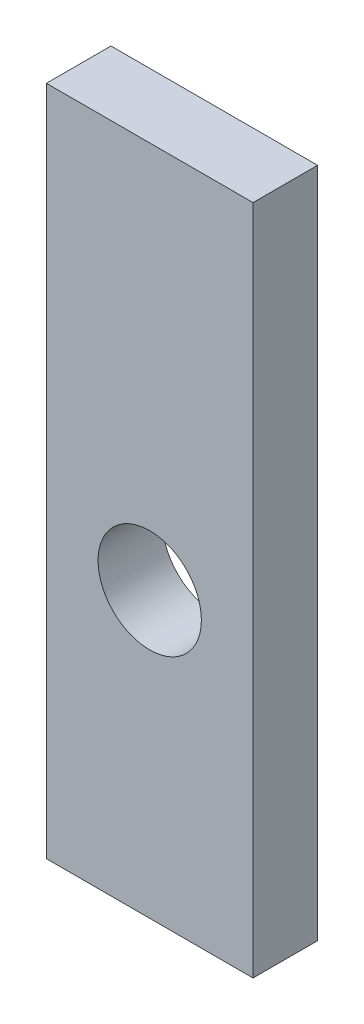
ISO-10303-21;
HEADER;
FILE_DESCRIPTION(('STEP AP214'),'2;1');
FILE_NAME('part.step','',(''),(''),'','','');
FILE_SCHEMA(('AUTOMOTIVE_DESIGN { 1 0 10303 214 1 1 1 1 }'));
ENDSEC;
DATA;
#1=APPLICATION_CONTEXT('core data for automotive mechanical design processes');
#2=APPLICATION_PROTOCOL_DEFINITION('international standard','automotive_design',2000,#1);
#3=PRODUCT_CONTEXT('',#1,'mechanical');
#4=PRODUCT('Part','Part','',(#3));
#5=PRODUCT_RELATED_PRODUCT_CATEGORY('part','',(#4));
#6=PRODUCT_DEFINITION_FORMATION('','',#4);
#7=PRODUCT_DEFINITION_CONTEXT('part definition',#1,'design');
#8=PRODUCT_DEFINITION('design','',#6,#7);
#9=PRODUCT_DEFINITION_SHAPE('','',#8);
#10=(LENGTH_UNIT() NAMED_UNIT(*) SI_UNIT(.MILLI.,.METRE.));
#11=(NAMED_UNIT(*) PLANE_ANGLE_UNIT() SI_UNIT($,.RADIAN.));
#12=(NAMED_UNIT(*) SI_UNIT($,.STERADIAN.) SOLID_ANGLE_UNIT());
#13=UNCERTAINTY_MEASURE_WITH_UNIT(LENGTH_MEASURE(1.E-05),#10,'distance_accuracy_value','');
#14=(GEOMETRIC_REPRESENTATION_CONTEXT(3) GLOBAL_UNCERTAINTY_ASSIGNED_CONTEXT((#13)) GLOBAL_UNIT_ASSIGNED_CONTEXT((#10,
#11,#12)) REPRESENTATION_CONTEXT('',''));
#15=CARTESIAN_POINT('',(0.,0.,0.));
#16=DIRECTION('',(0.,0.,1.));
#17=DIRECTION('',(1.,0.,0.));
#18=AXIS2_PLACEMENT_3D('',#15,#16,#17);
#19=CARTESIAN_POINT('',(8.,30.,2.5));
#20=DIRECTION('',(0.,0.,-1.));
#21=DIRECTION('',(-1.,0.,0.));
#22=AXIS2_PLACEMENT_3D('',#19,#20,#21);
#23=PLANE('',#22);
#24=DIRECTION('',(0.,1.,0.));
#25=VECTOR('',#24,1.);
#26=CARTESIAN_POINT('',(8.,-22.,2.5));
#27=LINE('',#26,#25);
#28=CARTESIAN_POINT('',(8.,-22.,2.5));
#29=VERTEX_POINT('',#28);
#30=CARTESIAN_POINT('',(8.,30.,2.5));
#31=VERTEX_POINT('',#30);
#32=EDGE_CURVE('E84',#29,#31,#27,.T.);
#33=ORIENTED_EDGE('',*,*,#32,.T.);
#34=DIRECTION('',(-1.,0.,0.));
#35=VECTOR('',#34,1.);
#36=CARTESIAN_POINT('',(-8.,30.,2.5));
#37=LINE('',#36,#35);
#38=CARTESIAN_POINT('',(-8.,30.,2.5));
#39=VERTEX_POINT('',#38);
#40=EDGE_CURVE('E79',#31,#39,#37,.T.);
#41=ORIENTED_EDGE('',*,*,#40,.T.);
#42=DIRECTION('',(0.,-1.,0.));
#43=VECTOR('',#42,1.);
#44=CARTESIAN_POINT('',(-8.,-22.,2.5));
#45=LINE('',#44,#43);
#46=CARTESIAN_POINT('',(-8.,-22.,2.5));
#47=VERTEX_POINT('',#46);
#48=EDGE_CURVE('E82',#39,#47,#45,.T.);
#49=ORIENTED_EDGE('',*,*,#48,.T.);
#50=DIRECTION('',(1.,0.,0.));
#51=VECTOR('',#50,1.);
#52=CARTESIAN_POINT('',(-8.,-22.,2.5));
#53=LINE('',#52,#51);
#54=EDGE_CURVE('E49',#47,#29,#53,.T.);
#55=ORIENTED_EDGE('',*,*,#54,.T.);
#56=EDGE_LOOP('',(#33,#41,#49,#55));
#57=FACE_BOUND('',#56,.T.);
#58=CARTESIAN_POINT('',(0.,0.,2.5));
#59=DIRECTION('',(0.,0.,1.));
#60=DIRECTION('',(1.,0.,0.));
#61=AXIS2_PLACEMENT_3D('',#58,#59,#60);
#62=CIRCLE('',#61,4.);
#63=CARTESIAN_POINT('',(4.,0.,2.5));
#64=VERTEX_POINT('',#63);
#65=EDGE_CURVE('E99',#64,#64,#62,.T.);
#66=ORIENTED_EDGE('',*,*,#65,.F.);
#67=EDGE_LOOP('',(#66));
#68=FACE_BOUND('',#67,.T.);
#69=ADVANCED_FACE('F32',(#57,#68),#23,.F.);
#70=CARTESIAN_POINT('',(8.,30.,-2.5));
#71=DIRECTION('',(0.,0.,-1.));
#72=DIRECTION('',(-1.,0.,0.));
#73=AXIS2_PLACEMENT_3D('',#70,#71,#72);
#74=PLANE('',#73);
#75=DIRECTION('',(0.,1.,0.));
#76=VECTOR('',#75,1.);
#77=CARTESIAN_POINT('',(8.,-22.,-2.5));
#78=LINE('',#77,#76);
#79=CARTESIAN_POINT('',(8.,-22.,-2.5));
#80=VERTEX_POINT('',#79);
#81=CARTESIAN_POINT('',(8.,30.,-2.5));
#82=VERTEX_POINT('',#81);
#83=EDGE_CURVE('E96',#80,#82,#78,.T.);
#84=ORIENTED_EDGE('',*,*,#83,.F.);
#85=DIRECTION('',(1.,0.,0.));
#86=VECTOR('',#85,1.);
#87=CARTESIAN_POINT('',(-8.,-22.,-2.5));
#88=LINE('',#87,#86);
#89=CARTESIAN_POINT('',(-8.,-22.,-2.5));
#90=VERTEX_POINT('',#89);
#91=EDGE_CURVE('E72',#90,#80,#88,.T.);
#92=ORIENTED_EDGE('',*,*,#91,.F.);
#93=DIRECTION('',(0.,-1.,0.));
#94=VECTOR('',#93,1.);
#95=CARTESIAN_POINT('',(-8.,-22.,-2.5));
#96=LINE('',#95,#94);
#97=CARTESIAN_POINT('',(-8.,30.,-2.5));
#98=VERTEX_POINT('',#97);
#99=EDGE_CURVE('E66',#98,#90,#96,.T.);
#100=ORIENTED_EDGE('',*,*,#99,.F.);
#101=DIRECTION('',(-1.,0.,0.));
#102=VECTOR('',#101,1.);
#103=CARTESIAN_POINT('',(-8.,30.,-2.5));
#104=LINE('',#103,#102);
#105=EDGE_CURVE('E88',#82,#98,#104,.T.);
#106=ORIENTED_EDGE('',*,*,#105,.F.);
#107=EDGE_LOOP('',(#84,#92,#100,#106));
#108=FACE_BOUND('',#107,.T.);
#109=CARTESIAN_POINT('',(0.,0.,-2.5));
#110=DIRECTION('',(0.,0.,1.));
#111=DIRECTION('',(1.,0.,0.));
#112=AXIS2_PLACEMENT_3D('',#109,#110,#111);
#113=CIRCLE('',#112,4.);
#114=CARTESIAN_POINT('',(4.,0.,-2.5));
#115=VERTEX_POINT('',#114);
#116=EDGE_CURVE('E111',#115,#115,#113,.T.);
#117=ORIENTED_EDGE('',*,*,#116,.T.);
#118=EDGE_LOOP('',(#117));
#119=FACE_BOUND('',#118,.T.);
#120=ADVANCED_FACE('F107',(#108,#119),#74,.T.);
#121=CARTESIAN_POINT('',(8.,-22.,2.5));
#122=DIRECTION('',(-1.,0.,0.));
#123=DIRECTION('',(0.,0.,1.));
#124=AXIS2_PLACEMENT_3D('',#121,#122,#123);
#125=PLANE('',#124);
#126=ORIENTED_EDGE('',*,*,#83,.T.);
#127=DIRECTION('',(0.,0.,-1.));
#128=VECTOR('',#127,1.);
#129=CARTESIAN_POINT('',(8.,30.,2.5));
#130=LINE('',#129,#128);
#131=EDGE_CURVE('E11',#31,#82,#130,.T.);
#132=ORIENTED_EDGE('',*,*,#131,.F.);
#133=ORIENTED_EDGE('',*,*,#32,.F.);
#134=DIRECTION('',(0.,0.,-1.));
#135=VECTOR('',#134,1.);
#136=CARTESIAN_POINT('',(8.,-22.,2.5));
#137=LINE('',#136,#135);
#138=EDGE_CURVE('E92',#29,#80,#137,.T.);
#139=ORIENTED_EDGE('',*,*,#138,.T.);
#140=EDGE_LOOP('',(#126,#132,#133,#139));
#141=FACE_BOUND('',#140,.T.);
#142=ADVANCED_FACE('F34',(#141),#125,.F.);
#143=CARTESIAN_POINT('',(-8.,30.,2.5));
#144=DIRECTION('',(0.,-1.,0.));
#145=DIRECTION('',(0.,0.,-1.));
#146=AXIS2_PLACEMENT_3D('',#143,#144,#145);
#147=PLANE('',#146);
#148=ORIENTED_EDGE('',*,*,#105,.T.);
#149=DIRECTION('',(0.,0.,-1.));
#150=VECTOR('',#149,1.);
#151=CARTESIAN_POINT('',(-8.,30.,2.5));
#152=LINE('',#151,#150);
#153=EDGE_CURVE('E41',#39,#98,#152,.T.);
#154=ORIENTED_EDGE('',*,*,#153,.F.);
#155=ORIENTED_EDGE('',*,*,#40,.F.);
#156=ORIENTED_EDGE('',*,*,#131,.T.);
#157=EDGE_LOOP('',(#148,#154,#155,#156));
#158=FACE_BOUND('',#157,.T.);
#159=ADVANCED_FACE('F87',(#158),#147,.F.);
#160=CARTESIAN_POINT('',(-8.,-22.,2.5));
#161=DIRECTION('',(1.,0.,0.));
#162=DIRECTION('',(0.,0.,-1.));
#163=AXIS2_PLACEMENT_3D('',#160,#161,#162);
#164=PLANE('',#163);
#165=ORIENTED_EDGE('',*,*,#99,.T.);
#166=DIRECTION('',(0.,0.,-1.));
#167=VECTOR('',#166,1.);
#168=CARTESIAN_POINT('',(-8.,-22.,2.5));
#169=LINE('',#168,#167);
#170=EDGE_CURVE('E89',#47,#90,#169,.T.);
#171=ORIENTED_EDGE('',*,*,#170,.F.);
#172=ORIENTED_EDGE('',*,*,#48,.F.);
#173=ORIENTED_EDGE('',*,*,#153,.T.);
#174=EDGE_LOOP('',(#165,#171,#172,#173));
#175=FACE_BOUND('',#174,.T.);
#176=ADVANCED_FACE('F90',(#175),#164,.F.);
#177=CARTESIAN_POINT('',(-8.,-22.,2.5));
#178=DIRECTION('',(0.,1.,0.));
#179=DIRECTION('',(0.,0.,1.));
#180=AXIS2_PLACEMENT_3D('',#177,#178,#179);
#181=PLANE('',#180);
#182=ORIENTED_EDGE('',*,*,#91,.T.);
#183=ORIENTED_EDGE('',*,*,#138,.F.);
#184=ORIENTED_EDGE('',*,*,#54,.F.);
#185=ORIENTED_EDGE('',*,*,#170,.T.);
#186=EDGE_LOOP('',(#182,#183,#184,#185));
#187=FACE_BOUND('',#186,.T.);
#188=ADVANCED_FACE('F104',(#187),#181,.F.);
#189=CARTESIAN_POINT('',(0.,0.,2.5));
#190=DIRECTION('',(0.,0.,-1.));
#191=DIRECTION('',(-1.,0.,0.));
#192=AXIS2_PLACEMENT_3D('',#189,#190,#191);
#193=CYLINDRICAL_SURFACE('',#192,4.);
#194=ORIENTED_EDGE('',*,*,#65,.T.);
#195=EDGE_LOOP('',(#194));
#196=FACE_BOUND('',#195,.T.);
#197=ORIENTED_EDGE('',*,*,#116,.F.);
#198=EDGE_LOOP('',(#197));
#199=FACE_BOUND('',#198,.T.);
#200=ADVANCED_FACE('F117',(#196,#199),#193,.F.);
#201=CLOSED_SHELL('',(#69,#120,#142,#159,#176,#188,#200));
#202=MANIFOLD_SOLID_BREP('B2',#201);
#203=ADVANCED_BREP_SHAPE_REPRESENTATION('',(#18,#202),#14);
#204=SHAPE_DEFINITION_REPRESENTATION(#9,#203);
ENDSEC;
END-ISO-10303-21;
